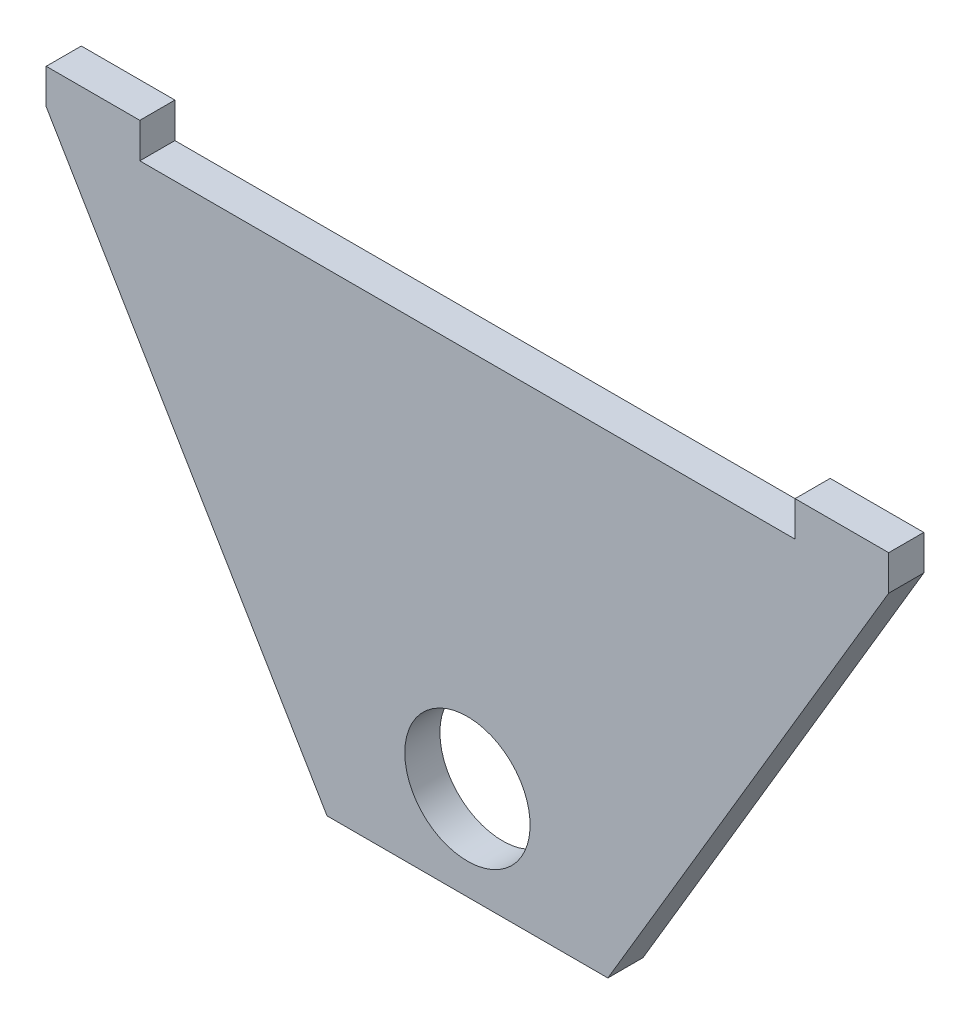
ISO-10303-21;
HEADER;
FILE_DESCRIPTION(('STEP AP214'),'2;1');
FILE_NAME('part.step','',(''),(''),'','','');
FILE_SCHEMA(('AUTOMOTIVE_DESIGN { 1 0 10303 214 1 1 1 1 }'));
ENDSEC;
DATA;
#1=APPLICATION_CONTEXT('core data for automotive mechanical design processes');
#2=APPLICATION_PROTOCOL_DEFINITION('international standard','automotive_design',2000,#1);
#3=PRODUCT_CONTEXT('',#1,'mechanical');
#4=PRODUCT('Part','Part','',(#3));
#5=PRODUCT_RELATED_PRODUCT_CATEGORY('part','',(#4));
#6=PRODUCT_DEFINITION_FORMATION('','',#4);
#7=PRODUCT_DEFINITION_CONTEXT('part definition',#1,'design');
#8=PRODUCT_DEFINITION('design','',#6,#7);
#9=PRODUCT_DEFINITION_SHAPE('','',#8);
#10=(LENGTH_UNIT() NAMED_UNIT(*) SI_UNIT(.MILLI.,.METRE.));
#11=(NAMED_UNIT(*) PLANE_ANGLE_UNIT() SI_UNIT($,.RADIAN.));
#12=(NAMED_UNIT(*) SI_UNIT($,.STERADIAN.) SOLID_ANGLE_UNIT());
#13=UNCERTAINTY_MEASURE_WITH_UNIT(LENGTH_MEASURE(1.E-05),#10,'distance_accuracy_value','');
#14=(GEOMETRIC_REPRESENTATION_CONTEXT(3) GLOBAL_UNCERTAINTY_ASSIGNED_CONTEXT((#13)) GLOBAL_UNIT_ASSIGNED_CONTEXT((#10,
#11,#12)) REPRESENTATION_CONTEXT('',''));
#15=CARTESIAN_POINT('',(0.,0.,0.));
#16=DIRECTION('',(0.,0.,1.));
#17=DIRECTION('',(1.,0.,0.));
#18=AXIS2_PLACEMENT_3D('',#15,#16,#17);
#19=CARTESIAN_POINT('',(0.,0.,4.7625));
#20=DIRECTION('',(0.,0.,-1.));
#21=DIRECTION('',(-1.,0.,0.));
#22=AXIS2_PLACEMENT_3D('',#19,#20,#21);
#23=PLANE('',#22);
#24=DIRECTION('',(0.50998877017092,-0.860181059021618,0.));
#25=VECTOR('',#24,1.);
#26=CARTESIAN_POINT('',(0.,0.,4.7625));
#27=LINE('',#26,#25);
#28=CARTESIAN_POINT('',(-38.1,64.262,4.7625));
#29=VERTEX_POINT('',#28);
#30=CARTESIAN_POINT('',(0.,0.,4.7625));
#31=VERTEX_POINT('',#30);
#32=EDGE_CURVE('E161',#29,#31,#27,.T.);
#33=ORIENTED_EDGE('',*,*,#32,.T.);
#34=DIRECTION('',(1.,0.,0.));
#35=VECTOR('',#34,1.);
#36=CARTESIAN_POINT('',(38.1,0.,4.7625));
#37=LINE('',#36,#35);
#38=CARTESIAN_POINT('',(38.1,0.,4.7625));
#39=VERTEX_POINT('',#38);
#40=EDGE_CURVE('E99',#31,#39,#37,.T.);
#41=ORIENTED_EDGE('',*,*,#40,.T.);
#42=DIRECTION('',(0.509988770170919,0.860181059021619,0.));
#43=VECTOR('',#42,1.);
#44=CARTESIAN_POINT('',(38.1,0.,4.7625));
#45=LINE('',#44,#43);
#46=CARTESIAN_POINT('',(76.2,64.262,4.7625));
#47=VERTEX_POINT('',#46);
#48=EDGE_CURVE('E182',#39,#47,#45,.T.);
#49=ORIENTED_EDGE('',*,*,#48,.T.);
#50=DIRECTION('',(0.,1.,0.));
#51=VECTOR('',#50,1.);
#52=CARTESIAN_POINT('',(76.2,64.262,4.7625));
#53=LINE('',#52,#51);
#54=CARTESIAN_POINT('',(76.2,69.0245,4.7625));
#55=VERTEX_POINT('',#54);
#56=EDGE_CURVE('E201',#47,#55,#53,.T.);
#57=ORIENTED_EDGE('',*,*,#56,.T.);
#58=DIRECTION('',(-1.,0.,0.));
#59=VECTOR('',#58,1.);
#60=CARTESIAN_POINT('',(63.5,69.0245,4.7625));
#61=LINE('',#60,#59);
#62=CARTESIAN_POINT('',(63.5,69.0245,4.7625));
#63=VERTEX_POINT('',#62);
#64=EDGE_CURVE('E198',#55,#63,#61,.T.);
#65=ORIENTED_EDGE('',*,*,#64,.T.);
#66=DIRECTION('',(0.,-1.,0.));
#67=VECTOR('',#66,1.);
#68=CARTESIAN_POINT('',(63.5,64.262,4.7625));
#69=LINE('',#68,#67);
#70=CARTESIAN_POINT('',(63.5,64.262,4.7625));
#71=VERTEX_POINT('',#70);
#72=EDGE_CURVE('E200',#63,#71,#69,.T.);
#73=ORIENTED_EDGE('',*,*,#72,.T.);
#74=DIRECTION('',(-1.,0.,0.));
#75=VECTOR('',#74,1.);
#76=CARTESIAN_POINT('',(-25.4,64.262,4.7625));
#77=LINE('',#76,#75);
#78=CARTESIAN_POINT('',(-25.4,64.262,4.7625));
#79=VERTEX_POINT('',#78);
#80=EDGE_CURVE('E124',#71,#79,#77,.T.);
#81=ORIENTED_EDGE('',*,*,#80,.T.);
#82=DIRECTION('',(0.,1.,0.));
#83=VECTOR('',#82,1.);
#84=CARTESIAN_POINT('',(-25.4,69.0245,4.7625));
#85=LINE('',#84,#83);
#86=CARTESIAN_POINT('',(-25.4,69.0245,4.7625));
#87=VERTEX_POINT('',#86);
#88=EDGE_CURVE('E118',#79,#87,#85,.T.);
#89=ORIENTED_EDGE('',*,*,#88,.T.);
#90=DIRECTION('',(-1.,0.,0.));
#91=VECTOR('',#90,1.);
#92=CARTESIAN_POINT('',(-38.1,69.0245,4.7625));
#93=LINE('',#92,#91);
#94=CARTESIAN_POINT('',(-38.1,69.0245,4.7625));
#95=VERTEX_POINT('',#94);
#96=EDGE_CURVE('E122',#87,#95,#93,.T.);
#97=ORIENTED_EDGE('',*,*,#96,.T.);
#98=DIRECTION('',(0.,-1.,0.));
#99=VECTOR('',#98,1.);
#100=CARTESIAN_POINT('',(-38.1,64.262,4.7625));
#101=LINE('',#100,#99);
#102=EDGE_CURVE('E50',#95,#29,#101,.T.);
#103=ORIENTED_EDGE('',*,*,#102,.T.);
#104=EDGE_LOOP('',(#33,#41,#49,#57,#65,#73,#81,#89,#97,#103));
#105=FACE_BOUND('',#104,.T.);
#106=CARTESIAN_POINT('',(19.05,12.7,4.7625));
#107=DIRECTION('',(0.,0.,1.));
#108=DIRECTION('',(1.,0.,0.));
#109=AXIS2_PLACEMENT_3D('',#106,#107,#108);
#110=CIRCLE('',#109,8.50000000000001);
#111=CARTESIAN_POINT('',(10.55,12.7,4.7625));
#112=VERTEX_POINT('',#111);
#113=EDGE_CURVE('E146',#112,#112,#110,.T.);
#114=ORIENTED_EDGE('',*,*,#113,.F.);
#115=EDGE_LOOP('',(#114));
#116=FACE_BOUND('',#115,.T.);
#117=ADVANCED_FACE('F33',(#105,#116),#23,.F.);
#118=CARTESIAN_POINT('',(0.,0.,0.));
#119=DIRECTION('',(0.,0.,-1.));
#120=DIRECTION('',(-1.,0.,0.));
#121=AXIS2_PLACEMENT_3D('',#118,#119,#120);
#122=PLANE('',#121);
#123=DIRECTION('',(0.50998877017092,-0.860181059021618,0.));
#124=VECTOR('',#123,1.);
#125=CARTESIAN_POINT('',(0.,0.,0.));
#126=LINE('',#125,#124);
#127=CARTESIAN_POINT('',(-38.1,64.262,0.));
#128=VERTEX_POINT('',#127);
#129=CARTESIAN_POINT('',(0.,0.,0.));
#130=VERTEX_POINT('',#129);
#131=EDGE_CURVE('E142',#128,#130,#126,.T.);
#132=ORIENTED_EDGE('',*,*,#131,.F.);
#133=DIRECTION('',(0.,-1.,0.));
#134=VECTOR('',#133,1.);
#135=CARTESIAN_POINT('',(-38.1,64.262,0.));
#136=LINE('',#135,#134);
#137=CARTESIAN_POINT('',(-38.1,69.0245,0.));
#138=VERTEX_POINT('',#137);
#139=EDGE_CURVE('E91',#138,#128,#136,.T.);
#140=ORIENTED_EDGE('',*,*,#139,.F.);
#141=DIRECTION('',(-1.,0.,0.));
#142=VECTOR('',#141,1.);
#143=CARTESIAN_POINT('',(-38.1,69.0245,0.));
#144=LINE('',#143,#142);
#145=CARTESIAN_POINT('',(-25.4,69.0245,0.));
#146=VERTEX_POINT('',#145);
#147=EDGE_CURVE('E85',#146,#138,#144,.T.);
#148=ORIENTED_EDGE('',*,*,#147,.F.);
#149=DIRECTION('',(0.,1.,0.));
#150=VECTOR('',#149,1.);
#151=CARTESIAN_POINT('',(-25.4,69.0245,0.));
#152=LINE('',#151,#150);
#153=CARTESIAN_POINT('',(-25.4,64.262,0.));
#154=VERTEX_POINT('',#153);
#155=EDGE_CURVE('E132',#154,#146,#152,.T.);
#156=ORIENTED_EDGE('',*,*,#155,.F.);
#157=DIRECTION('',(-1.,0.,0.));
#158=VECTOR('',#157,1.);
#159=CARTESIAN_POINT('',(-25.4,64.262,0.));
#160=LINE('',#159,#158);
#161=CARTESIAN_POINT('',(63.5,64.262,0.));
#162=VERTEX_POINT('',#161);
#163=EDGE_CURVE('E156',#162,#154,#160,.T.);
#164=ORIENTED_EDGE('',*,*,#163,.F.);
#165=DIRECTION('',(0.,-1.,0.));
#166=VECTOR('',#165,1.);
#167=CARTESIAN_POINT('',(63.5,64.262,0.));
#168=LINE('',#167,#166);
#169=CARTESIAN_POINT('',(63.5,69.0245,0.));
#170=VERTEX_POINT('',#169);
#171=EDGE_CURVE('E154',#170,#162,#168,.T.);
#172=ORIENTED_EDGE('',*,*,#171,.F.);
#173=DIRECTION('',(-1.,0.,0.));
#174=VECTOR('',#173,1.);
#175=CARTESIAN_POINT('',(63.5,69.0245,0.));
#176=LINE('',#175,#174);
#177=CARTESIAN_POINT('',(76.2,69.0245,0.));
#178=VERTEX_POINT('',#177);
#179=EDGE_CURVE('E152',#178,#170,#176,.T.);
#180=ORIENTED_EDGE('',*,*,#179,.F.);
#181=DIRECTION('',(0.,1.,0.));
#182=VECTOR('',#181,1.);
#183=CARTESIAN_POINT('',(76.2,64.262,0.));
#184=LINE('',#183,#182);
#185=CARTESIAN_POINT('',(76.2,64.262,0.));
#186=VERTEX_POINT('',#185);
#187=EDGE_CURVE('E150',#186,#178,#184,.T.);
#188=ORIENTED_EDGE('',*,*,#187,.F.);
#189=DIRECTION('',(0.509988770170919,0.860181059021619,0.));
#190=VECTOR('',#189,1.);
#191=CARTESIAN_POINT('',(38.1,0.,0.));
#192=LINE('',#191,#190);
#193=CARTESIAN_POINT('',(38.1,0.,0.));
#194=VERTEX_POINT('',#193);
#195=EDGE_CURVE('E148',#194,#186,#192,.T.);
#196=ORIENTED_EDGE('',*,*,#195,.F.);
#197=DIRECTION('',(1.,0.,0.));
#198=VECTOR('',#197,1.);
#199=CARTESIAN_POINT('',(38.1,0.,0.));
#200=LINE('',#199,#198);
#201=EDGE_CURVE('E145',#130,#194,#200,.T.);
#202=ORIENTED_EDGE('',*,*,#201,.F.);
#203=EDGE_LOOP('',(#132,#140,#148,#156,#164,#172,#180,#188,#196,#202));
#204=FACE_BOUND('',#203,.T.);
#205=CARTESIAN_POINT('',(19.05,12.7,0.));
#206=DIRECTION('',(0.,0.,1.));
#207=DIRECTION('',(1.,0.,0.));
#208=AXIS2_PLACEMENT_3D('',#205,#206,#207);
#209=CIRCLE('',#208,8.50000000000001);
#210=CARTESIAN_POINT('',(10.55,12.7,0.));
#211=VERTEX_POINT('',#210);
#212=EDGE_CURVE('E209',#211,#211,#209,.T.);
#213=ORIENTED_EDGE('',*,*,#212,.T.);
#214=EDGE_LOOP('',(#213));
#215=FACE_BOUND('',#214,.T.);
#216=ADVANCED_FACE('F186',(#204,#215),#122,.T.);
#217=CARTESIAN_POINT('',(0.,0.,4.7625));
#218=DIRECTION('',(0.860181059021618,0.50998877017092,0.));
#219=DIRECTION('',(-0.50998877017092,0.860181059021618,0.));
#220=AXIS2_PLACEMENT_3D('',#217,#218,#219);
#221=PLANE('',#220);
#222=ORIENTED_EDGE('',*,*,#131,.T.);
#223=DIRECTION('',(0.,0.,-1.));
#224=VECTOR('',#223,1.);
#225=CARTESIAN_POINT('',(0.,0.,4.7625));
#226=LINE('',#225,#224);
#227=EDGE_CURVE('E11',#31,#130,#226,.T.);
#228=ORIENTED_EDGE('',*,*,#227,.F.);
#229=ORIENTED_EDGE('',*,*,#32,.F.);
#230=DIRECTION('',(0.,0.,-1.));
#231=VECTOR('',#230,1.);
#232=CARTESIAN_POINT('',(-38.1,64.262,4.7625));
#233=LINE('',#232,#231);
#234=EDGE_CURVE('E138',#29,#128,#233,.T.);
#235=ORIENTED_EDGE('',*,*,#234,.T.);
#236=EDGE_LOOP('',(#222,#228,#229,#235));
#237=FACE_BOUND('',#236,.T.);
#238=ADVANCED_FACE('F35',(#237),#221,.F.);
#239=CARTESIAN_POINT('',(38.1,0.,4.7625));
#240=DIRECTION('',(0.,1.,0.));
#241=DIRECTION('',(-1.,0.,0.));
#242=AXIS2_PLACEMENT_3D('',#239,#240,#241);
#243=PLANE('',#242);
#244=ORIENTED_EDGE('',*,*,#201,.T.);
#245=DIRECTION('',(0.,0.,-1.));
#246=VECTOR('',#245,1.);
#247=CARTESIAN_POINT('',(38.1,0.,4.7625));
#248=LINE('',#247,#246);
#249=EDGE_CURVE('E42',#39,#194,#248,.T.);
#250=ORIENTED_EDGE('',*,*,#249,.F.);
#251=ORIENTED_EDGE('',*,*,#40,.F.);
#252=ORIENTED_EDGE('',*,*,#227,.T.);
#253=EDGE_LOOP('',(#244,#250,#251,#252));
#254=FACE_BOUND('',#253,.T.);
#255=ADVANCED_FACE('F245',(#254),#243,.F.);
#256=CARTESIAN_POINT('',(38.1,0.,4.7625));
#257=DIRECTION('',(-0.860181059021619,0.509988770170919,0.));
#258=DIRECTION('',(-0.509988770170919,-0.860181059021619,0.));
#259=AXIS2_PLACEMENT_3D('',#256,#257,#258);
#260=PLANE('',#259);
#261=ORIENTED_EDGE('',*,*,#195,.T.);
#262=DIRECTION('',(0.,0.,-1.));
#263=VECTOR('',#262,1.);
#264=CARTESIAN_POINT('',(76.2,64.262,4.7625));
#265=LINE('',#264,#263);
#266=EDGE_CURVE('E174',#47,#186,#265,.T.);
#267=ORIENTED_EDGE('',*,*,#266,.F.);
#268=ORIENTED_EDGE('',*,*,#48,.F.);
#269=ORIENTED_EDGE('',*,*,#249,.T.);
#270=EDGE_LOOP('',(#261,#267,#268,#269));
#271=FACE_BOUND('',#270,.T.);
#272=ADVANCED_FACE('F180',(#271),#260,.F.);
#273=CARTESIAN_POINT('',(76.2,64.262,4.7625));
#274=DIRECTION('',(-1.,0.,0.));
#275=DIRECTION('',(0.,-1.,0.));
#276=AXIS2_PLACEMENT_3D('',#273,#274,#275);
#277=PLANE('',#276);
#278=ORIENTED_EDGE('',*,*,#187,.T.);
#279=DIRECTION('',(0.,0.,-1.));
#280=VECTOR('',#279,1.);
#281=CARTESIAN_POINT('',(76.2,69.0245,4.7625));
#282=LINE('',#281,#280);
#283=EDGE_CURVE('E171',#55,#178,#282,.T.);
#284=ORIENTED_EDGE('',*,*,#283,.F.);
#285=ORIENTED_EDGE('',*,*,#56,.F.);
#286=ORIENTED_EDGE('',*,*,#266,.T.);
#287=EDGE_LOOP('',(#278,#284,#285,#286));
#288=FACE_BOUND('',#287,.T.);
#289=ADVANCED_FACE('F192',(#288),#277,.F.);
#290=CARTESIAN_POINT('',(63.5,69.0245,4.7625));
#291=DIRECTION('',(0.,-1.,0.));
#292=DIRECTION('',(0.,0.,-1.));
#293=AXIS2_PLACEMENT_3D('',#290,#291,#292);
#294=PLANE('',#293);
#295=ORIENTED_EDGE('',*,*,#179,.T.);
#296=DIRECTION('',(0.,0.,-1.));
#297=VECTOR('',#296,1.);
#298=CARTESIAN_POINT('',(63.5,69.0245,4.7625));
#299=LINE('',#298,#297);
#300=EDGE_CURVE('E168',#63,#170,#299,.T.);
#301=ORIENTED_EDGE('',*,*,#300,.F.);
#302=ORIENTED_EDGE('',*,*,#64,.F.);
#303=ORIENTED_EDGE('',*,*,#283,.T.);
#304=EDGE_LOOP('',(#295,#301,#302,#303));
#305=FACE_BOUND('',#304,.T.);
#306=ADVANCED_FACE('F196',(#305),#294,.F.);
#307=CARTESIAN_POINT('',(63.5,64.262,4.7625));
#308=DIRECTION('',(1.,0.,0.));
#309=DIRECTION('',(0.,0.,-1.));
#310=AXIS2_PLACEMENT_3D('',#307,#308,#309);
#311=PLANE('',#310);
#312=ORIENTED_EDGE('',*,*,#171,.T.);
#313=DIRECTION('',(0.,0.,-1.));
#314=VECTOR('',#313,1.);
#315=CARTESIAN_POINT('',(63.5,64.262,4.7625));
#316=LINE('',#315,#314);
#317=EDGE_CURVE('E165',#71,#162,#316,.T.);
#318=ORIENTED_EDGE('',*,*,#317,.F.);
#319=ORIENTED_EDGE('',*,*,#72,.F.);
#320=ORIENTED_EDGE('',*,*,#300,.T.);
#321=EDGE_LOOP('',(#312,#318,#319,#320));
#322=FACE_BOUND('',#321,.T.);
#323=ADVANCED_FACE('F235',(#322),#311,.F.);
#324=CARTESIAN_POINT('',(-25.4,64.262,4.7625));
#325=DIRECTION('',(0.,-1.,0.));
#326=DIRECTION('',(0.,0.,-1.));
#327=AXIS2_PLACEMENT_3D('',#324,#325,#326);
#328=PLANE('',#327);
#329=ORIENTED_EDGE('',*,*,#163,.T.);
#330=DIRECTION('',(0.,0.,-1.));
#331=VECTOR('',#330,1.);
#332=CARTESIAN_POINT('',(-25.4,64.262,4.7625));
#333=LINE('',#332,#331);
#334=EDGE_CURVE('E133',#79,#154,#333,.T.);
#335=ORIENTED_EDGE('',*,*,#334,.F.);
#336=ORIENTED_EDGE('',*,*,#80,.F.);
#337=ORIENTED_EDGE('',*,*,#317,.T.);
#338=EDGE_LOOP('',(#329,#335,#336,#337));
#339=FACE_BOUND('',#338,.T.);
#340=ADVANCED_FACE('F232',(#339),#328,.F.);
#341=CARTESIAN_POINT('',(-25.4,69.0245,4.7625));
#342=DIRECTION('',(-1.,0.,0.));
#343=DIRECTION('',(0.,0.,1.));
#344=AXIS2_PLACEMENT_3D('',#341,#342,#343);
#345=PLANE('',#344);
#346=ORIENTED_EDGE('',*,*,#155,.T.);
#347=DIRECTION('',(0.,0.,-1.));
#348=VECTOR('',#347,1.);
#349=CARTESIAN_POINT('',(-25.4,69.0245,4.7625));
#350=LINE('',#349,#348);
#351=EDGE_CURVE('E129',#87,#146,#350,.T.);
#352=ORIENTED_EDGE('',*,*,#351,.F.);
#353=ORIENTED_EDGE('',*,*,#88,.F.);
#354=ORIENTED_EDGE('',*,*,#334,.T.);
#355=EDGE_LOOP('',(#346,#352,#353,#354));
#356=FACE_BOUND('',#355,.T.);
#357=ADVANCED_FACE('F130',(#356),#345,.F.);
#358=CARTESIAN_POINT('',(-38.1,69.0245,4.7625));
#359=DIRECTION('',(0.,-1.,0.));
#360=DIRECTION('',(0.,0.,-1.));
#361=AXIS2_PLACEMENT_3D('',#358,#359,#360);
#362=PLANE('',#361);
#363=ORIENTED_EDGE('',*,*,#147,.T.);
#364=DIRECTION('',(0.,0.,-1.));
#365=VECTOR('',#364,1.);
#366=CARTESIAN_POINT('',(-38.1,69.0245,4.7625));
#367=LINE('',#366,#365);
#368=EDGE_CURVE('E134',#95,#138,#367,.T.);
#369=ORIENTED_EDGE('',*,*,#368,.F.);
#370=ORIENTED_EDGE('',*,*,#96,.F.);
#371=ORIENTED_EDGE('',*,*,#351,.T.);
#372=EDGE_LOOP('',(#363,#369,#370,#371));
#373=FACE_BOUND('',#372,.T.);
#374=ADVANCED_FACE('F136',(#373),#362,.F.);
#375=CARTESIAN_POINT('',(-38.1,64.262,4.7625));
#376=DIRECTION('',(1.,0.,0.));
#377=DIRECTION('',(0.,1.,0.));
#378=AXIS2_PLACEMENT_3D('',#375,#376,#377);
#379=PLANE('',#378);
#380=ORIENTED_EDGE('',*,*,#139,.T.);
#381=ORIENTED_EDGE('',*,*,#234,.F.);
#382=ORIENTED_EDGE('',*,*,#102,.F.);
#383=ORIENTED_EDGE('',*,*,#368,.T.);
#384=EDGE_LOOP('',(#380,#381,#382,#383));
#385=FACE_BOUND('',#384,.T.);
#386=ADVANCED_FACE('F225',(#385),#379,.F.);
#387=CARTESIAN_POINT('',(19.05,12.7,4.7625));
#388=DIRECTION('',(0.,0.,-1.));
#389=DIRECTION('',(-1.,0.,0.));
#390=AXIS2_PLACEMENT_3D('',#387,#388,#389);
#391=CYLINDRICAL_SURFACE('',#390,8.50000000000001);
#392=CARTESIAN_POINT('',(10.55,12.7,4.7625));
#393=CARTESIAN_POINT('',(10.55,12.7,4.712890625));
#394=CARTESIAN_POINT('',(10.55,12.7,4.66328125));
#395=CARTESIAN_POINT('',(10.55,12.7,4.5640625));
#396=CARTESIAN_POINT('',(10.55,12.7,4.514453125));
#397=CARTESIAN_POINT('',(10.55,12.7,4.415234375));
#398=CARTESIAN_POINT('',(10.55,12.7,4.365625));
#399=CARTESIAN_POINT('',(10.55,12.7,4.26640625));
#400=CARTESIAN_POINT('',(10.55,12.7,4.216796875));
#401=CARTESIAN_POINT('',(10.55,12.7,4.117578125));
#402=CARTESIAN_POINT('',(10.55,12.7,4.06796875));
#403=CARTESIAN_POINT('',(10.55,12.7,3.96875));
#404=CARTESIAN_POINT('',(10.55,12.7,3.919140625));
#405=CARTESIAN_POINT('',(10.55,12.7,3.819921875));
#406=CARTESIAN_POINT('',(10.55,12.7,3.7703125));
#407=CARTESIAN_POINT('',(10.55,12.7,3.67109375));
#408=CARTESIAN_POINT('',(10.55,12.7,3.621484375));
#409=CARTESIAN_POINT('',(10.55,12.7,3.522265625));
#410=CARTESIAN_POINT('',(10.55,12.7,3.47265625));
#411=CARTESIAN_POINT('',(10.55,12.7,3.3734375));
#412=CARTESIAN_POINT('',(10.55,12.7,3.323828125));
#413=CARTESIAN_POINT('',(10.55,12.7,3.224609375));
#414=CARTESIAN_POINT('',(10.55,12.7,3.175));
#415=CARTESIAN_POINT('',(10.55,12.7,3.07578125));
#416=CARTESIAN_POINT('',(10.55,12.7,3.026171875));
#417=CARTESIAN_POINT('',(10.55,12.7,2.926953125));
#418=CARTESIAN_POINT('',(10.55,12.7,2.87734375));
#419=CARTESIAN_POINT('',(10.55,12.7,2.778125));
#420=CARTESIAN_POINT('',(10.55,12.7,2.728515625));
#421=CARTESIAN_POINT('',(10.55,12.7,2.629296875));
#422=CARTESIAN_POINT('',(10.55,12.7,2.5796875));
#423=CARTESIAN_POINT('',(10.55,12.7,2.48046875));
#424=CARTESIAN_POINT('',(10.55,12.7,2.430859375));
#425=CARTESIAN_POINT('',(10.55,12.7,2.331640625));
#426=CARTESIAN_POINT('',(10.55,12.7,2.28203125));
#427=CARTESIAN_POINT('',(10.55,12.7,2.1828125));
#428=CARTESIAN_POINT('',(10.55,12.7,2.133203125));
#429=CARTESIAN_POINT('',(10.55,12.7,2.033984375));
#430=CARTESIAN_POINT('',(10.55,12.7,1.984375));
#431=CARTESIAN_POINT('',(10.55,12.7,1.88515625));
#432=CARTESIAN_POINT('',(10.55,12.7,1.835546875));
#433=CARTESIAN_POINT('',(10.55,12.7,1.736328125));
#434=CARTESIAN_POINT('',(10.55,12.7,1.68671875));
#435=CARTESIAN_POINT('',(10.55,12.7,1.5875));
#436=CARTESIAN_POINT('',(10.55,12.7,1.537890625));
#437=CARTESIAN_POINT('',(10.55,12.7,1.438671875));
#438=CARTESIAN_POINT('',(10.55,12.7,1.3890625));
#439=CARTESIAN_POINT('',(10.55,12.7,1.28984375));
#440=CARTESIAN_POINT('',(10.55,12.7,1.240234375));
#441=CARTESIAN_POINT('',(10.55,12.7,1.141015625));
#442=CARTESIAN_POINT('',(10.55,12.7,1.09140625));
#443=CARTESIAN_POINT('',(10.55,12.7,0.992187499999999));
#444=CARTESIAN_POINT('',(10.55,12.7,0.942578124999999));
#445=CARTESIAN_POINT('',(10.55,12.7,0.843359375));
#446=CARTESIAN_POINT('',(10.55,12.7,0.79375));
#447=CARTESIAN_POINT('',(10.55,12.7,0.69453125));
#448=CARTESIAN_POINT('',(10.55,12.7,0.644921875));
#449=CARTESIAN_POINT('',(10.55,12.7,0.545703125));
#450=CARTESIAN_POINT('',(10.55,12.7,0.49609375));
#451=CARTESIAN_POINT('',(10.55,12.7,0.396875));
#452=CARTESIAN_POINT('',(10.55,12.7,0.347265625));
#453=CARTESIAN_POINT('',(10.55,12.7,0.248046875));
#454=CARTESIAN_POINT('',(10.55,12.7,0.1984375));
#455=CARTESIAN_POINT('',(10.55,12.7,0.09921875));
#456=CARTESIAN_POINT('',(10.55,12.7,0.049609375));
#457=CARTESIAN_POINT('',(10.55,12.7,0.));
#458=B_SPLINE_CURVE_WITH_KNOTS('',3,(#392,#393,#394,#395,#396,#397,#398,#399,#400,#401,#402,
#403,#404,#405,#406,#407,#408,#409,#410,#411,#412,#413,#414,#415,#416,#417,#418,#419,#420,#421,
#422,#423,#424,#425,#426,#427,#428,#429,#430,#431,#432,#433,#434,#435,#436,#437,#438,#439,#440,
#441,#442,#443,#444,#445,#446,#447,#448,#449,#450,#451,#452,#453,#454,#455,#456,#457),
.UNSPECIFIED.,.F.,.F.,(4,2,2,2,2,2,2,2,2,2,2,2,2,2,2,2,2,2,2,2,2,2,2,2,2,2,2,2,2,2,2,2,4),(0.,
0.148828125,0.29765625,0.446484375,0.5953125,0.744140625,0.892968750000001,1.041796875,1.190625,
1.339453125,1.48828125,1.637109375,1.7859375,1.934765625,2.08359375,2.232421875,2.38125,
2.530078125,2.67890625,2.827734375,2.9765625,3.125390625,3.27421875,3.423046875,3.571875,
3.720703125,3.86953125,4.018359375,4.1671875,4.316015625,4.46484375,4.613671875,4.7625),.UNSPECIFIED.);
#459=EDGE_CURVE('BSEAM215',#112,#211,#458,.T.);
#460=ORIENTED_EDGE('',*,*,#113,.T.);
#461=ORIENTED_EDGE('',*,*,#212,.F.);
#462=ORIENTED_EDGE('',*,*,#459,.T.);
#463=ORIENTED_EDGE('',*,*,#459,.F.);
#464=EDGE_LOOP('',(#460,#462,#461,#463));
#465=FACE_BOUND('',#464,.T.);
#466=ADVANCED_FACE('F215',(#465),#391,.F.);
#467=CLOSED_SHELL('',(#117,#216,#238,#255,#272,#289,#306,#323,#340,#357,#374,#386,#466));
#468=MANIFOLD_SOLID_BREP('B2',#467);
#469=ADVANCED_BREP_SHAPE_REPRESENTATION('',(#18,#468),#14);
#470=SHAPE_DEFINITION_REPRESENTATION(#9,#469);
ENDSEC;
END-ISO-10303-21;
